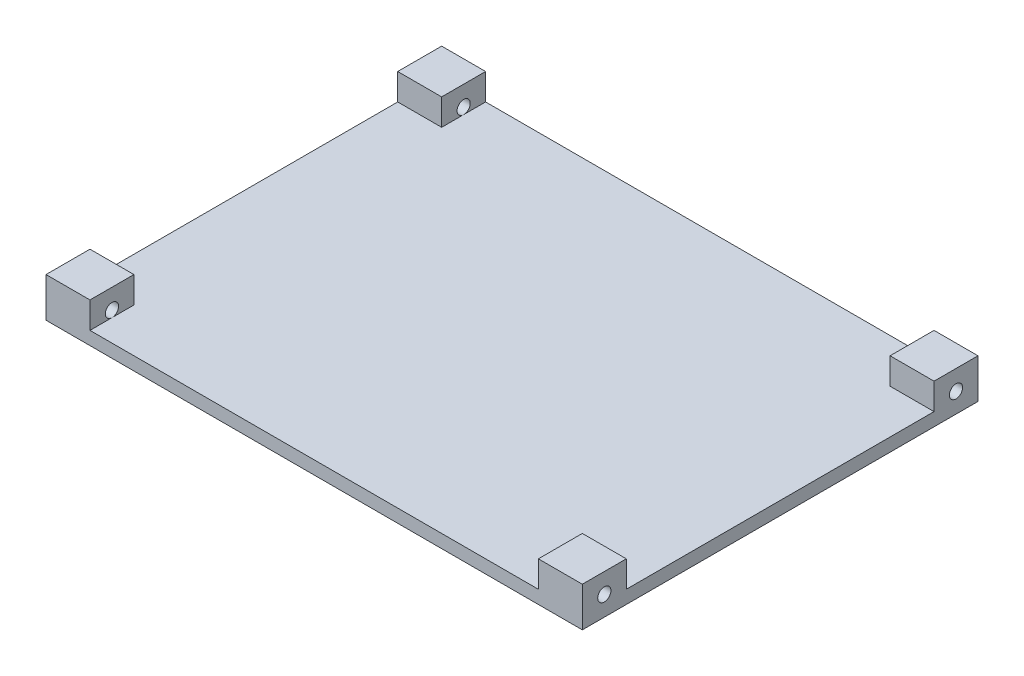
ISO-10303-21;
HEADER;
FILE_DESCRIPTION(('STEP AP214'),'2;1');
FILE_NAME('part.step','',(''),(''),'','','');
FILE_SCHEMA(('AUTOMOTIVE_DESIGN { 1 0 10303 214 1 1 1 1 }'));
ENDSEC;
DATA;
#1=APPLICATION_CONTEXT('core data for automotive mechanical design processes');
#2=APPLICATION_PROTOCOL_DEFINITION('international standard','automotive_design',2000,#1);
#3=PRODUCT_CONTEXT('',#1,'mechanical');
#4=PRODUCT('Part','Part','',(#3));
#5=PRODUCT_RELATED_PRODUCT_CATEGORY('part','',(#4));
#6=PRODUCT_DEFINITION_FORMATION('','',#4);
#7=PRODUCT_DEFINITION_CONTEXT('part definition',#1,'design');
#8=PRODUCT_DEFINITION('design','',#6,#7);
#9=PRODUCT_DEFINITION_SHAPE('','',#8);
#10=(LENGTH_UNIT() NAMED_UNIT(*) SI_UNIT(.MILLI.,.METRE.));
#11=(NAMED_UNIT(*) PLANE_ANGLE_UNIT() SI_UNIT($,.RADIAN.));
#12=(NAMED_UNIT(*) SI_UNIT($,.STERADIAN.) SOLID_ANGLE_UNIT());
#13=UNCERTAINTY_MEASURE_WITH_UNIT(LENGTH_MEASURE(1.E-05),#10,'distance_accuracy_value','');
#14=(GEOMETRIC_REPRESENTATION_CONTEXT(3) GLOBAL_UNCERTAINTY_ASSIGNED_CONTEXT((#13)) GLOBAL_UNIT_ASSIGNED_CONTEXT((#10,
#11,#12)) REPRESENTATION_CONTEXT('',''));
#15=CARTESIAN_POINT('',(0.,0.,0.));
#16=DIRECTION('',(0.,0.,1.));
#17=DIRECTION('',(1.,0.,0.));
#18=AXIS2_PLACEMENT_3D('',#15,#16,#17);
#19=CARTESIAN_POINT('',(0.,3.,0.));
#20=DIRECTION('',(0.,-1.,0.));
#21=DIRECTION('',(0.,0.,-1.));
#22=AXIS2_PLACEMENT_3D('',#19,#20,#21);
#23=PLANE('',#22);
#24=DIRECTION('',(-1.,0.,0.));
#25=VECTOR('',#24,1.);
#26=CARTESIAN_POINT('',(122.,3.,-10.));
#27=LINE('',#26,#25);
#28=CARTESIAN_POINT('',(122.,3.,-10.));
#29=VERTEX_POINT('',#28);
#30=CARTESIAN_POINT('',(112.,3.,-10.));
#31=VERTEX_POINT('',#30);
#32=EDGE_CURVE('E325',#29,#31,#27,.T.);
#33=ORIENTED_EDGE('',*,*,#32,.F.);
#34=DIRECTION('',(0.,0.,-1.));
#35=VECTOR('',#34,1.);
#36=CARTESIAN_POINT('',(122.,3.,0.));
#37=LINE('',#36,#35);
#38=CARTESIAN_POINT('',(122.,3.,-80.));
#39=VERTEX_POINT('',#38);
#40=EDGE_CURVE('E180',#29,#39,#37,.T.);
#41=ORIENTED_EDGE('',*,*,#40,.T.);
#42=DIRECTION('',(1.,0.,0.));
#43=VECTOR('',#42,1.);
#44=CARTESIAN_POINT('',(122.,3.,-80.));
#45=LINE('',#44,#43);
#46=CARTESIAN_POINT('',(112.,3.,-80.));
#47=VERTEX_POINT('',#46);
#48=EDGE_CURVE('E194',#47,#39,#45,.T.);
#49=ORIENTED_EDGE('',*,*,#48,.F.);
#50=DIRECTION('',(0.,0.,1.));
#51=VECTOR('',#50,1.);
#52=CARTESIAN_POINT('',(112.,3.,-90.));
#53=LINE('',#52,#51);
#54=CARTESIAN_POINT('',(112.,3.,-85.));
#55=VERTEX_POINT('',#54);
#56=EDGE_CURVE('E182',#55,#47,#53,.T.);
#57=ORIENTED_EDGE('',*,*,#56,.F.);
#58=CARTESIAN_POINT('',(112.,3.,-90.));
#59=VERTEX_POINT('',#58);
#60=EDGE_CURVE('E184',#59,#55,#53,.T.);
#61=ORIENTED_EDGE('',*,*,#60,.F.);
#62=DIRECTION('',(-1.,0.,0.));
#63=VECTOR('',#62,1.);
#64=CARTESIAN_POINT('',(0.,3.,-90.));
#65=LINE('',#64,#63);
#66=CARTESIAN_POINT('',(10.,3.,-90.));
#67=VERTEX_POINT('',#66);
#68=EDGE_CURVE('E270',#59,#67,#65,.T.);
#69=ORIENTED_EDGE('',*,*,#68,.T.);
#70=DIRECTION('',(0.,0.,-1.));
#71=VECTOR('',#70,1.);
#72=CARTESIAN_POINT('',(10.,3.,-90.));
#73=LINE('',#72,#71);
#74=CARTESIAN_POINT('',(9.99999999999999,3.,-85.));
#75=VERTEX_POINT('',#74);
#76=EDGE_CURVE('E226',#75,#67,#73,.T.);
#77=ORIENTED_EDGE('',*,*,#76,.F.);
#78=CARTESIAN_POINT('',(10.,3.,-80.));
#79=VERTEX_POINT('',#78);
#80=EDGE_CURVE('E216',#79,#75,#73,.T.);
#81=ORIENTED_EDGE('',*,*,#80,.F.);
#82=DIRECTION('',(1.,0.,0.));
#83=VECTOR('',#82,1.);
#84=CARTESIAN_POINT('',(0.,3.,-80.));
#85=LINE('',#84,#83);
#86=CARTESIAN_POINT('',(0.,3.,-80.));
#87=VERTEX_POINT('',#86);
#88=EDGE_CURVE('E211',#87,#79,#85,.T.);
#89=ORIENTED_EDGE('',*,*,#88,.F.);
#90=DIRECTION('',(0.,0.,1.));
#91=VECTOR('',#90,1.);
#92=CARTESIAN_POINT('',(0.,3.,0.));
#93=LINE('',#92,#91);
#94=CARTESIAN_POINT('',(0.,3.,-10.));
#95=VERTEX_POINT('',#94);
#96=EDGE_CURVE('E263',#87,#95,#93,.T.);
#97=ORIENTED_EDGE('',*,*,#96,.T.);
#98=DIRECTION('',(-1.,0.,0.));
#99=VECTOR('',#98,1.);
#100=CARTESIAN_POINT('',(0.,3.,-10.));
#101=LINE('',#100,#99);
#102=CARTESIAN_POINT('',(10.,3.,-10.));
#103=VERTEX_POINT('',#102);
#104=EDGE_CURVE('E242',#103,#95,#101,.T.);
#105=ORIENTED_EDGE('',*,*,#104,.F.);
#106=DIRECTION('',(0.,0.,-1.));
#107=VECTOR('',#106,1.);
#108=CARTESIAN_POINT('',(10.,3.,-10.));
#109=LINE('',#108,#107);
#110=CARTESIAN_POINT('',(9.99999999999999,3.,-5.));
#111=VERTEX_POINT('',#110);
#112=EDGE_CURVE('E237',#111,#103,#109,.T.);
#113=ORIENTED_EDGE('',*,*,#112,.F.);
#114=CARTESIAN_POINT('',(10.,3.,0.));
#115=VERTEX_POINT('',#114);
#116=EDGE_CURVE('E249',#115,#111,#109,.T.);
#117=ORIENTED_EDGE('',*,*,#116,.F.);
#118=DIRECTION('',(1.,0.,0.));
#119=VECTOR('',#118,1.);
#120=CARTESIAN_POINT('',(0.,3.,0.));
#121=LINE('',#120,#119);
#122=CARTESIAN_POINT('',(112.,3.,0.));
#123=VERTEX_POINT('',#122);
#124=EDGE_CURVE('E265',#115,#123,#121,.T.);
#125=ORIENTED_EDGE('',*,*,#124,.T.);
#126=DIRECTION('',(0.,0.,1.));
#127=VECTOR('',#126,1.);
#128=CARTESIAN_POINT('',(112.,3.,0.));
#129=LINE('',#128,#127);
#130=CARTESIAN_POINT('',(112.,3.,-5.));
#131=VERTEX_POINT('',#130);
#132=EDGE_CURVE('E328',#131,#123,#129,.T.);
#133=ORIENTED_EDGE('',*,*,#132,.F.);
#134=EDGE_CURVE('E176',#31,#131,#129,.T.);
#135=ORIENTED_EDGE('',*,*,#134,.F.);
#136=EDGE_LOOP('',(#33,#41,#49,#57,#61,#69,#77,#81,#89,#97,#105,#113,#117,#125,#133,#135));
#137=FACE_BOUND('',#136,.T.);
#138=ADVANCED_FACE('F33',(#137),#23,.F.);
#139=CARTESIAN_POINT('',(0.,3.,0.));
#140=DIRECTION('',(1.,0.,0.));
#141=DIRECTION('',(0.,0.,-1.));
#142=AXIS2_PLACEMENT_3D('',#139,#140,#141);
#143=PLANE('',#142);
#144=CARTESIAN_POINT('',(0.,4.5,-85.));
#145=DIRECTION('',(-1.,0.,0.));
#146=DIRECTION('',(0.,0.,1.));
#147=AXIS2_PLACEMENT_3D('',#144,#145,#146);
#148=CIRCLE('',#147,1.5);
#149=CARTESIAN_POINT('',(0.,4.5,-83.5));
#150=VERTEX_POINT('',#149);
#151=EDGE_CURVE('E331',#150,#150,#148,.T.);
#152=ORIENTED_EDGE('',*,*,#151,.F.);
#153=EDGE_LOOP('',(#152));
#154=FACE_BOUND('',#153,.T.);
#155=CARTESIAN_POINT('',(0.,4.5,-5.));
#156=DIRECTION('',(-1.,0.,0.));
#157=DIRECTION('',(0.,0.,1.));
#158=AXIS2_PLACEMENT_3D('',#155,#156,#157);
#159=CIRCLE('',#158,1.5);
#160=CARTESIAN_POINT('',(0.,4.5,-3.5));
#161=VERTEX_POINT('',#160);
#162=EDGE_CURVE('E341',#161,#161,#159,.T.);
#163=ORIENTED_EDGE('',*,*,#162,.F.);
#164=EDGE_LOOP('',(#163));
#165=FACE_BOUND('',#164,.T.);
#166=DIRECTION('',(0.,0.,1.));
#167=VECTOR('',#166,1.);
#168=CARTESIAN_POINT('',(0.,0.,0.));
#169=LINE('',#168,#167);
#170=CARTESIAN_POINT('',(0.,0.,-90.));
#171=VERTEX_POINT('',#170);
#172=CARTESIAN_POINT('',(0.,0.,0.));
#173=VERTEX_POINT('',#172);
#174=EDGE_CURVE('E262',#171,#173,#169,.T.);
#175=ORIENTED_EDGE('',*,*,#174,.T.);
#176=DIRECTION('',(0.,-1.,0.));
#177=VECTOR('',#176,1.);
#178=CARTESIAN_POINT('',(0.,3.,0.));
#179=LINE('',#178,#177);
#180=CARTESIAN_POINT('',(0.,9.,0.));
#181=VERTEX_POINT('',#180);
#182=EDGE_CURVE('E11',#181,#173,#179,.T.);
#183=ORIENTED_EDGE('',*,*,#182,.F.);
#184=DIRECTION('',(0.,0.,1.));
#185=VECTOR('',#184,1.);
#186=CARTESIAN_POINT('',(0.,9.,0.));
#187=LINE('',#186,#185);
#188=CARTESIAN_POINT('',(0.,9.,-10.));
#189=VERTEX_POINT('',#188);
#190=EDGE_CURVE('E238',#189,#181,#187,.T.);
#191=ORIENTED_EDGE('',*,*,#190,.F.);
#192=DIRECTION('',(0.,-1.,0.));
#193=VECTOR('',#192,1.);
#194=CARTESIAN_POINT('',(0.,9.,-10.));
#195=LINE('',#194,#193);
#196=EDGE_CURVE('E248',#189,#95,#195,.T.);
#197=ORIENTED_EDGE('',*,*,#196,.T.);
#198=ORIENTED_EDGE('',*,*,#96,.F.);
#199=DIRECTION('',(0.,-1.,0.));
#200=VECTOR('',#199,1.);
#201=CARTESIAN_POINT('',(0.,9.,-80.));
#202=LINE('',#201,#200);
#203=CARTESIAN_POINT('',(0.,9.,-80.));
#204=VERTEX_POINT('',#203);
#205=EDGE_CURVE('E234',#204,#87,#202,.T.);
#206=ORIENTED_EDGE('',*,*,#205,.F.);
#207=DIRECTION('',(0.,0.,1.));
#208=VECTOR('',#207,1.);
#209=CARTESIAN_POINT('',(0.,9.,-90.));
#210=LINE('',#209,#208);
#211=CARTESIAN_POINT('',(0.,9.,-90.));
#212=VERTEX_POINT('',#211);
#213=EDGE_CURVE('E212',#212,#204,#210,.T.);
#214=ORIENTED_EDGE('',*,*,#213,.F.);
#215=DIRECTION('',(0.,-1.,0.));
#216=VECTOR('',#215,1.);
#217=CARTESIAN_POINT('',(0.,3.,-90.));
#218=LINE('',#217,#216);
#219=EDGE_CURVE('E273',#212,#171,#218,.T.);
#220=ORIENTED_EDGE('',*,*,#219,.T.);
#221=EDGE_LOOP('',(#175,#183,#191,#197,#198,#206,#214,#220));
#222=FACE_BOUND('',#221,.T.);
#223=ADVANCED_FACE('F35',(#154,#165,#222),#143,.F.);
#224=CARTESIAN_POINT('',(0.,3.,0.));
#225=DIRECTION('',(0.,0.,-1.));
#226=DIRECTION('',(-1.,0.,0.));
#227=AXIS2_PLACEMENT_3D('',#224,#225,#226);
#228=PLANE('',#227);
#229=DIRECTION('',(1.,0.,0.));
#230=VECTOR('',#229,1.);
#231=CARTESIAN_POINT('',(0.,0.,0.));
#232=LINE('',#231,#230);
#233=CARTESIAN_POINT('',(122.,0.,0.));
#234=VERTEX_POINT('',#233);
#235=EDGE_CURVE('E276',#173,#234,#232,.T.);
#236=ORIENTED_EDGE('',*,*,#235,.T.);
#237=DIRECTION('',(0.,-1.,0.));
#238=VECTOR('',#237,1.);
#239=CARTESIAN_POINT('',(122.,3.,0.));
#240=LINE('',#239,#238);
#241=CARTESIAN_POINT('',(122.,9.,0.));
#242=VERTEX_POINT('',#241);
#243=EDGE_CURVE('E41',#242,#234,#240,.T.);
#244=ORIENTED_EDGE('',*,*,#243,.F.);
#245=DIRECTION('',(1.,0.,0.));
#246=VECTOR('',#245,1.);
#247=CARTESIAN_POINT('',(122.,9.,0.));
#248=LINE('',#247,#246);
#249=CARTESIAN_POINT('',(112.,9.,0.));
#250=VERTEX_POINT('',#249);
#251=EDGE_CURVE('E173',#250,#242,#248,.T.);
#252=ORIENTED_EDGE('',*,*,#251,.F.);
#253=DIRECTION('',(0.,-1.,0.));
#254=VECTOR('',#253,1.);
#255=CARTESIAN_POINT('',(112.,9.,0.));
#256=LINE('',#255,#254);
#257=EDGE_CURVE('E186',#250,#123,#256,.T.);
#258=ORIENTED_EDGE('',*,*,#257,.T.);
#259=ORIENTED_EDGE('',*,*,#124,.F.);
#260=DIRECTION('',(0.,-1.,0.));
#261=VECTOR('',#260,1.);
#262=CARTESIAN_POINT('',(10.,9.,0.));
#263=LINE('',#262,#261);
#264=CARTESIAN_POINT('',(10.,9.,0.));
#265=VERTEX_POINT('',#264);
#266=EDGE_CURVE('E259',#265,#115,#263,.T.);
#267=ORIENTED_EDGE('',*,*,#266,.F.);
#268=DIRECTION('',(1.,0.,0.));
#269=VECTOR('',#268,1.);
#270=CARTESIAN_POINT('',(0.,9.,0.));
#271=LINE('',#270,#269);
#272=EDGE_CURVE('E241',#181,#265,#271,.T.);
#273=ORIENTED_EDGE('',*,*,#272,.F.);
#274=ORIENTED_EDGE('',*,*,#182,.T.);
#275=EDGE_LOOP('',(#236,#244,#252,#258,#259,#267,#273,#274));
#276=FACE_BOUND('',#275,.T.);
#277=ADVANCED_FACE('F359',(#276),#228,.F.);
#278=CARTESIAN_POINT('',(122.,3.,0.));
#279=DIRECTION('',(-1.,0.,0.));
#280=DIRECTION('',(0.,0.,1.));
#281=AXIS2_PLACEMENT_3D('',#278,#279,#280);
#282=PLANE('',#281);
#283=CARTESIAN_POINT('',(122.,4.5,-85.));
#284=DIRECTION('',(1.,0.,0.));
#285=DIRECTION('',(0.,0.,-1.));
#286=AXIS2_PLACEMENT_3D('',#283,#284,#285);
#287=CIRCLE('',#286,1.5);
#288=CARTESIAN_POINT('',(122.,4.5,-86.5));
#289=VERTEX_POINT('',#288);
#290=EDGE_CURVE('E347',#289,#289,#287,.T.);
#291=ORIENTED_EDGE('',*,*,#290,.F.);
#292=EDGE_LOOP('',(#291));
#293=FACE_BOUND('',#292,.T.);
#294=CARTESIAN_POINT('',(122.,4.5,-5.));
#295=DIRECTION('',(1.,0.,0.));
#296=DIRECTION('',(0.,0.,-1.));
#297=AXIS2_PLACEMENT_3D('',#294,#295,#296);
#298=CIRCLE('',#297,1.5);
#299=CARTESIAN_POINT('',(122.,4.5,-6.5));
#300=VERTEX_POINT('',#299);
#301=EDGE_CURVE('E348',#300,#300,#298,.T.);
#302=ORIENTED_EDGE('',*,*,#301,.F.);
#303=EDGE_LOOP('',(#302));
#304=FACE_BOUND('',#303,.T.);
#305=DIRECTION('',(0.,0.,-1.));
#306=VECTOR('',#305,1.);
#307=CARTESIAN_POINT('',(122.,0.,0.));
#308=LINE('',#307,#306);
#309=CARTESIAN_POINT('',(122.,0.,-90.));
#310=VERTEX_POINT('',#309);
#311=EDGE_CURVE('E278',#234,#310,#308,.T.);
#312=ORIENTED_EDGE('',*,*,#311,.T.);
#313=DIRECTION('',(0.,-1.,0.));
#314=VECTOR('',#313,1.);
#315=CARTESIAN_POINT('',(122.,3.,-90.));
#316=LINE('',#315,#314);
#317=CARTESIAN_POINT('',(122.,9.,-90.));
#318=VERTEX_POINT('',#317);
#319=EDGE_CURVE('E283',#318,#310,#316,.T.);
#320=ORIENTED_EDGE('',*,*,#319,.F.);
#321=DIRECTION('',(0.,0.,-1.));
#322=VECTOR('',#321,1.);
#323=CARTESIAN_POINT('',(122.,9.,-90.));
#324=LINE('',#323,#322);
#325=CARTESIAN_POINT('',(122.,9.,-80.));
#326=VERTEX_POINT('',#325);
#327=EDGE_CURVE('E190',#326,#318,#324,.T.);
#328=ORIENTED_EDGE('',*,*,#327,.F.);
#329=DIRECTION('',(0.,-1.,0.));
#330=VECTOR('',#329,1.);
#331=CARTESIAN_POINT('',(122.,9.,-80.));
#332=LINE('',#331,#330);
#333=EDGE_CURVE('E199',#326,#39,#332,.T.);
#334=ORIENTED_EDGE('',*,*,#333,.T.);
#335=ORIENTED_EDGE('',*,*,#40,.F.);
#336=DIRECTION('',(0.,-1.,0.));
#337=VECTOR('',#336,1.);
#338=CARTESIAN_POINT('',(122.,9.,-10.));
#339=LINE('',#338,#337);
#340=CARTESIAN_POINT('',(122.,9.,-10.));
#341=VERTEX_POINT('',#340);
#342=EDGE_CURVE('E161',#341,#29,#339,.T.);
#343=ORIENTED_EDGE('',*,*,#342,.F.);
#344=DIRECTION('',(0.,0.,-1.));
#345=VECTOR('',#344,1.);
#346=CARTESIAN_POINT('',(122.,9.,0.));
#347=LINE('',#346,#345);
#348=EDGE_CURVE('E167',#242,#341,#347,.T.);
#349=ORIENTED_EDGE('',*,*,#348,.F.);
#350=ORIENTED_EDGE('',*,*,#243,.T.);
#351=EDGE_LOOP('',(#312,#320,#328,#334,#335,#343,#349,#350));
#352=FACE_BOUND('',#351,.T.);
#353=ADVANCED_FACE('F178',(#293,#304,#352),#282,.F.);
#354=CARTESIAN_POINT('',(0.,3.,-90.));
#355=DIRECTION('',(0.,0.,1.));
#356=DIRECTION('',(1.,0.,0.));
#357=AXIS2_PLACEMENT_3D('',#354,#355,#356);
#358=PLANE('',#357);
#359=DIRECTION('',(-1.,0.,0.));
#360=VECTOR('',#359,1.);
#361=CARTESIAN_POINT('',(0.,0.,-90.));
#362=LINE('',#361,#360);
#363=EDGE_CURVE('E266',#310,#171,#362,.T.);
#364=ORIENTED_EDGE('',*,*,#363,.T.);
#365=ORIENTED_EDGE('',*,*,#219,.F.);
#366=DIRECTION('',(-1.,0.,0.));
#367=VECTOR('',#366,1.);
#368=CARTESIAN_POINT('',(0.,9.,-90.));
#369=LINE('',#368,#367);
#370=CARTESIAN_POINT('',(10.,9.,-90.));
#371=VERTEX_POINT('',#370);
#372=EDGE_CURVE('E220',#371,#212,#369,.T.);
#373=ORIENTED_EDGE('',*,*,#372,.F.);
#374=DIRECTION('',(0.,-1.,0.));
#375=VECTOR('',#374,1.);
#376=CARTESIAN_POINT('',(10.,9.,-90.));
#377=LINE('',#376,#375);
#378=EDGE_CURVE('E223',#371,#67,#377,.T.);
#379=ORIENTED_EDGE('',*,*,#378,.T.);
#380=ORIENTED_EDGE('',*,*,#68,.F.);
#381=DIRECTION('',(0.,-1.,0.));
#382=VECTOR('',#381,1.);
#383=CARTESIAN_POINT('',(112.,9.,-90.));
#384=LINE('',#383,#382);
#385=CARTESIAN_POINT('',(112.,9.,-90.));
#386=VERTEX_POINT('',#385);
#387=EDGE_CURVE('E208',#386,#59,#384,.T.);
#388=ORIENTED_EDGE('',*,*,#387,.F.);
#389=DIRECTION('',(-1.,0.,0.));
#390=VECTOR('',#389,1.);
#391=CARTESIAN_POINT('',(122.,9.,-90.));
#392=LINE('',#391,#390);
#393=EDGE_CURVE('E193',#318,#386,#392,.T.);
#394=ORIENTED_EDGE('',*,*,#393,.F.);
#395=ORIENTED_EDGE('',*,*,#319,.T.);
#396=EDGE_LOOP('',(#364,#365,#373,#379,#380,#388,#394,#395));
#397=FACE_BOUND('',#396,.T.);
#398=ADVANCED_FACE('F292',(#397),#358,.F.);
#399=CARTESIAN_POINT('',(0.,0.,0.));
#400=DIRECTION('',(0.,-1.,0.));
#401=DIRECTION('',(0.,0.,-1.));
#402=AXIS2_PLACEMENT_3D('',#399,#400,#401);
#403=PLANE('',#402);
#404=ORIENTED_EDGE('',*,*,#174,.F.);
#405=ORIENTED_EDGE('',*,*,#363,.F.);
#406=ORIENTED_EDGE('',*,*,#311,.F.);
#407=ORIENTED_EDGE('',*,*,#235,.F.);
#408=EDGE_LOOP('',(#404,#405,#406,#407));
#409=FACE_BOUND('',#408,.T.);
#410=ADVANCED_FACE('F290',(#409),#403,.T.);
#411=CARTESIAN_POINT('',(10.,9.,-10.));
#412=DIRECTION('',(-1.,0.,0.));
#413=DIRECTION('',(0.,0.,1.));
#414=AXIS2_PLACEMENT_3D('',#411,#412,#413);
#415=PLANE('',#414);
#416=ORIENTED_EDGE('',*,*,#116,.T.);
#417=CARTESIAN_POINT('',(9.99999999999999,4.5,-5.));
#418=DIRECTION('',(-1.,0.,0.));
#419=DIRECTION('',(0.,0.,1.));
#420=AXIS2_PLACEMENT_3D('',#417,#418,#419);
#421=CIRCLE('',#420,1.5);
#422=EDGE_CURVE('E339',#111,#111,#421,.F.);
#423=ORIENTED_EDGE('',*,*,#422,.F.);
#424=ORIENTED_EDGE('',*,*,#112,.T.);
#425=DIRECTION('',(0.,-1.,0.));
#426=VECTOR('',#425,1.);
#427=CARTESIAN_POINT('',(10.,9.,-10.));
#428=LINE('',#427,#426);
#429=CARTESIAN_POINT('',(10.,9.,-10.));
#430=VERTEX_POINT('',#429);
#431=EDGE_CURVE('E256',#430,#103,#428,.T.);
#432=ORIENTED_EDGE('',*,*,#431,.F.);
#433=DIRECTION('',(0.,0.,-1.));
#434=VECTOR('',#433,1.);
#435=CARTESIAN_POINT('',(10.,9.,0.));
#436=LINE('',#435,#434);
#437=EDGE_CURVE('E244',#265,#430,#436,.T.);
#438=ORIENTED_EDGE('',*,*,#437,.F.);
#439=ORIENTED_EDGE('',*,*,#266,.T.);
#440=EDGE_LOOP('',(#416,#423,#424,#432,#438,#439));
#441=FACE_BOUND('',#440,.T.);
#442=ADVANCED_FACE('F384',(#441),#415,.F.);
#443=CARTESIAN_POINT('',(0.,9.,-10.));
#444=DIRECTION('',(0.,0.,1.));
#445=DIRECTION('',(1.,0.,0.));
#446=AXIS2_PLACEMENT_3D('',#443,#444,#445);
#447=PLANE('',#446);
#448=ORIENTED_EDGE('',*,*,#104,.T.);
#449=ORIENTED_EDGE('',*,*,#196,.F.);
#450=DIRECTION('',(-1.,0.,0.));
#451=VECTOR('',#450,1.);
#452=CARTESIAN_POINT('',(7.78112740353881,9.,-10.));
#453=LINE('',#452,#451);
#454=EDGE_CURVE('E246',#430,#189,#453,.T.);
#455=ORIENTED_EDGE('',*,*,#454,.F.);
#456=ORIENTED_EDGE('',*,*,#431,.T.);
#457=EDGE_LOOP('',(#448,#449,#455,#456));
#458=FACE_BOUND('',#457,.T.);
#459=ADVANCED_FACE('F402',(#458),#447,.F.);
#460=CARTESIAN_POINT('',(0.,9.,0.));
#461=DIRECTION('',(0.,-1.,0.));
#462=DIRECTION('',(0.,0.,-1.));
#463=AXIS2_PLACEMENT_3D('',#460,#461,#462);
#464=PLANE('',#463);
#465=ORIENTED_EDGE('',*,*,#190,.T.);
#466=ORIENTED_EDGE('',*,*,#272,.T.);
#467=ORIENTED_EDGE('',*,*,#437,.T.);
#468=ORIENTED_EDGE('',*,*,#454,.T.);
#469=EDGE_LOOP('',(#465,#466,#467,#468));
#470=FACE_BOUND('',#469,.T.);
#471=ADVANCED_FACE('F397',(#470),#464,.F.);
#472=CARTESIAN_POINT('',(0.,9.,-80.));
#473=DIRECTION('',(0.,0.,-1.));
#474=DIRECTION('',(-1.,0.,0.));
#475=AXIS2_PLACEMENT_3D('',#472,#473,#474);
#476=PLANE('',#475);
#477=ORIENTED_EDGE('',*,*,#88,.T.);
#478=DIRECTION('',(0.,-1.,0.));
#479=VECTOR('',#478,1.);
#480=CARTESIAN_POINT('',(10.,9.,-80.));
#481=LINE('',#480,#479);
#482=CARTESIAN_POINT('',(10.,9.,-80.));
#483=VERTEX_POINT('',#482);
#484=EDGE_CURVE('E231',#483,#79,#481,.T.);
#485=ORIENTED_EDGE('',*,*,#484,.F.);
#486=DIRECTION('',(1.,0.,0.));
#487=VECTOR('',#486,1.);
#488=CARTESIAN_POINT('',(0.,9.,-80.));
#489=LINE('',#488,#487);
#490=EDGE_CURVE('E215',#204,#483,#489,.T.);
#491=ORIENTED_EDGE('',*,*,#490,.F.);
#492=ORIENTED_EDGE('',*,*,#205,.T.);
#493=EDGE_LOOP('',(#477,#485,#491,#492));
#494=FACE_BOUND('',#493,.T.);
#495=ADVANCED_FACE('F406',(#494),#476,.F.);
#496=CARTESIAN_POINT('',(10.,9.,-90.));
#497=DIRECTION('',(-1.,0.,0.));
#498=DIRECTION('',(0.,0.,1.));
#499=AXIS2_PLACEMENT_3D('',#496,#497,#498);
#500=PLANE('',#499);
#501=ORIENTED_EDGE('',*,*,#80,.T.);
#502=CARTESIAN_POINT('',(9.99999999999999,4.5,-85.));
#503=DIRECTION('',(-1.,0.,0.));
#504=DIRECTION('',(0.,0.,1.));
#505=AXIS2_PLACEMENT_3D('',#502,#503,#504);
#506=CIRCLE('',#505,1.5);
#507=EDGE_CURVE('E310',#75,#75,#506,.F.);
#508=ORIENTED_EDGE('',*,*,#507,.F.);
#509=ORIENTED_EDGE('',*,*,#76,.T.);
#510=ORIENTED_EDGE('',*,*,#378,.F.);
#511=DIRECTION('',(0.,0.,-1.));
#512=VECTOR('',#511,1.);
#513=CARTESIAN_POINT('',(10.,9.,-90.));
#514=LINE('',#513,#512);
#515=EDGE_CURVE('E218',#483,#371,#514,.T.);
#516=ORIENTED_EDGE('',*,*,#515,.F.);
#517=ORIENTED_EDGE('',*,*,#484,.T.);
#518=EDGE_LOOP('',(#501,#508,#509,#510,#516,#517));
#519=FACE_BOUND('',#518,.T.);
#520=ADVANCED_FACE('F307',(#519),#500,.F.);
#521=CARTESIAN_POINT('',(0.,9.,0.));
#522=DIRECTION('',(0.,1.,0.));
#523=DIRECTION('',(0.,0.,1.));
#524=AXIS2_PLACEMENT_3D('',#521,#522,#523);
#525=PLANE('',#524);
#526=ORIENTED_EDGE('',*,*,#213,.T.);
#527=ORIENTED_EDGE('',*,*,#490,.T.);
#528=ORIENTED_EDGE('',*,*,#515,.T.);
#529=ORIENTED_EDGE('',*,*,#372,.T.);
#530=EDGE_LOOP('',(#526,#527,#528,#529));
#531=FACE_BOUND('',#530,.T.);
#532=ADVANCED_FACE('F300',(#531),#525,.T.);
#533=CARTESIAN_POINT('',(112.,9.,-90.));
#534=DIRECTION('',(1.,0.,0.));
#535=DIRECTION('',(0.,0.,-1.));
#536=AXIS2_PLACEMENT_3D('',#533,#534,#535);
#537=PLANE('',#536);
#538=ORIENTED_EDGE('',*,*,#60,.T.);
#539=CARTESIAN_POINT('',(112.,4.5,-85.));
#540=DIRECTION('',(1.,0.,0.));
#541=DIRECTION('',(0.,0.,-1.));
#542=AXIS2_PLACEMENT_3D('',#539,#540,#541);
#543=CIRCLE('',#542,1.5);
#544=EDGE_CURVE('E46',#55,#55,#543,.F.);
#545=ORIENTED_EDGE('',*,*,#544,.F.);
#546=ORIENTED_EDGE('',*,*,#56,.T.);
#547=DIRECTION('',(0.,-1.,0.));
#548=VECTOR('',#547,1.);
#549=CARTESIAN_POINT('',(112.,9.,-80.));
#550=LINE('',#549,#548);
#551=CARTESIAN_POINT('',(112.,9.,-80.));
#552=VERTEX_POINT('',#551);
#553=EDGE_CURVE('E205',#552,#47,#550,.T.);
#554=ORIENTED_EDGE('',*,*,#553,.F.);
#555=DIRECTION('',(0.,0.,1.));
#556=VECTOR('',#555,1.);
#557=CARTESIAN_POINT('',(112.,9.,-90.));
#558=LINE('',#557,#556);
#559=EDGE_CURVE('E196',#386,#552,#558,.T.);
#560=ORIENTED_EDGE('',*,*,#559,.F.);
#561=ORIENTED_EDGE('',*,*,#387,.T.);
#562=EDGE_LOOP('',(#538,#545,#546,#554,#560,#561));
#563=FACE_BOUND('',#562,.T.);
#564=ADVANCED_FACE('F316',(#563),#537,.F.);
#565=CARTESIAN_POINT('',(122.,9.,-80.));
#566=DIRECTION('',(0.,0.,-1.));
#567=DIRECTION('',(-1.,0.,0.));
#568=AXIS2_PLACEMENT_3D('',#565,#566,#567);
#569=PLANE('',#568);
#570=ORIENTED_EDGE('',*,*,#48,.T.);
#571=ORIENTED_EDGE('',*,*,#333,.F.);
#572=DIRECTION('',(1.,0.,0.));
#573=VECTOR('',#572,1.);
#574=CARTESIAN_POINT('',(122.,9.,-80.));
#575=LINE('',#574,#573);
#576=EDGE_CURVE('E198',#552,#326,#575,.T.);
#577=ORIENTED_EDGE('',*,*,#576,.F.);
#578=ORIENTED_EDGE('',*,*,#553,.T.);
#579=EDGE_LOOP('',(#570,#571,#577,#578));
#580=FACE_BOUND('',#579,.T.);
#581=ADVANCED_FACE('F324',(#580),#569,.F.);
#582=CARTESIAN_POINT('',(0.,9.,0.));
#583=DIRECTION('',(0.,-1.,0.));
#584=DIRECTION('',(0.,0.,-1.));
#585=AXIS2_PLACEMENT_3D('',#582,#583,#584);
#586=PLANE('',#585);
#587=ORIENTED_EDGE('',*,*,#327,.T.);
#588=ORIENTED_EDGE('',*,*,#393,.T.);
#589=ORIENTED_EDGE('',*,*,#559,.T.);
#590=ORIENTED_EDGE('',*,*,#576,.T.);
#591=EDGE_LOOP('',(#587,#588,#589,#590));
#592=FACE_BOUND('',#591,.T.);
#593=ADVANCED_FACE('F320',(#592),#586,.F.);
#594=CARTESIAN_POINT('',(122.,9.,-10.));
#595=DIRECTION('',(0.,0.,1.));
#596=DIRECTION('',(1.,0.,0.));
#597=AXIS2_PLACEMENT_3D('',#594,#595,#596);
#598=PLANE('',#597);
#599=ORIENTED_EDGE('',*,*,#32,.T.);
#600=DIRECTION('',(0.,-1.,0.));
#601=VECTOR('',#600,1.);
#602=CARTESIAN_POINT('',(112.,9.,-10.));
#603=LINE('',#602,#601);
#604=CARTESIAN_POINT('',(112.,9.,-10.));
#605=VERTEX_POINT('',#604);
#606=EDGE_CURVE('E163',#605,#31,#603,.T.);
#607=ORIENTED_EDGE('',*,*,#606,.F.);
#608=DIRECTION('',(-1.,0.,0.));
#609=VECTOR('',#608,1.);
#610=CARTESIAN_POINT('',(122.,9.,-10.));
#611=LINE('',#610,#609);
#612=EDGE_CURVE('E156',#341,#605,#611,.T.);
#613=ORIENTED_EDGE('',*,*,#612,.F.);
#614=ORIENTED_EDGE('',*,*,#342,.T.);
#615=EDGE_LOOP('',(#599,#607,#613,#614));
#616=FACE_BOUND('',#615,.T.);
#617=ADVANCED_FACE('F159',(#616),#598,.F.);
#618=CARTESIAN_POINT('',(112.,9.,0.));
#619=DIRECTION('',(1.,0.,0.));
#620=DIRECTION('',(0.,0.,-1.));
#621=AXIS2_PLACEMENT_3D('',#618,#619,#620);
#622=PLANE('',#621);
#623=ORIENTED_EDGE('',*,*,#134,.T.);
#624=CARTESIAN_POINT('',(112.,4.5,-5.));
#625=DIRECTION('',(1.,0.,0.));
#626=DIRECTION('',(0.,0.,-1.));
#627=AXIS2_PLACEMENT_3D('',#624,#625,#626);
#628=CIRCLE('',#627,1.5);
#629=EDGE_CURVE('E51',#131,#131,#628,.F.);
#630=ORIENTED_EDGE('',*,*,#629,.F.);
#631=ORIENTED_EDGE('',*,*,#132,.T.);
#632=ORIENTED_EDGE('',*,*,#257,.F.);
#633=DIRECTION('',(0.,0.,1.));
#634=VECTOR('',#633,1.);
#635=CARTESIAN_POINT('',(112.,9.,0.));
#636=LINE('',#635,#634);
#637=EDGE_CURVE('E166',#605,#250,#636,.T.);
#638=ORIENTED_EDGE('',*,*,#637,.F.);
#639=ORIENTED_EDGE('',*,*,#606,.T.);
#640=EDGE_LOOP('',(#623,#630,#631,#632,#638,#639));
#641=FACE_BOUND('',#640,.T.);
#642=ADVANCED_FACE('F425',(#641),#622,.F.);
#643=CARTESIAN_POINT('',(0.,9.,0.));
#644=DIRECTION('',(0.,1.,0.));
#645=DIRECTION('',(0.,0.,1.));
#646=AXIS2_PLACEMENT_3D('',#643,#644,#645);
#647=PLANE('',#646);
#648=ORIENTED_EDGE('',*,*,#348,.T.);
#649=ORIENTED_EDGE('',*,*,#612,.T.);
#650=ORIENTED_EDGE('',*,*,#637,.T.);
#651=ORIENTED_EDGE('',*,*,#251,.T.);
#652=EDGE_LOOP('',(#648,#649,#650,#651));
#653=FACE_BOUND('',#652,.T.);
#654=ADVANCED_FACE('F171',(#653),#647,.T.);
#655=CARTESIAN_POINT('',(122.001,4.5,-85.));
#656=DIRECTION('',(-1.,0.,0.));
#657=DIRECTION('',(0.,0.,1.));
#658=AXIS2_PLACEMENT_3D('',#655,#656,#657);
#659=CYLINDRICAL_SURFACE('',#658,1.5);
#660=ORIENTED_EDGE('',*,*,#151,.T.);
#661=EDGE_LOOP('',(#660));
#662=FACE_BOUND('',#661,.T.);
#663=ORIENTED_EDGE('',*,*,#507,.T.);
#664=EDGE_LOOP('',(#663));
#665=FACE_BOUND('',#664,.T.);
#666=ADVANCED_FACE('F372',(#662,#665),#659,.F.);
#667=CARTESIAN_POINT('',(122.001,4.5,-5.));
#668=DIRECTION('',(-1.,0.,0.));
#669=DIRECTION('',(0.,0.,1.));
#670=AXIS2_PLACEMENT_3D('',#667,#668,#669);
#671=CYLINDRICAL_SURFACE('',#670,1.5);
#672=ORIENTED_EDGE('',*,*,#162,.T.);
#673=EDGE_LOOP('',(#672));
#674=FACE_BOUND('',#673,.T.);
#675=ORIENTED_EDGE('',*,*,#422,.T.);
#676=EDGE_LOOP('',(#675));
#677=FACE_BOUND('',#676,.T.);
#678=ADVANCED_FACE('F365',(#674,#677),#671,.F.);
#679=CARTESIAN_POINT('',(-0.001000000000001,4.5,-5.));
#680=DIRECTION('',(1.,0.,0.));
#681=DIRECTION('',(0.,0.,-1.));
#682=AXIS2_PLACEMENT_3D('',#679,#680,#681);
#683=CYLINDRICAL_SURFACE('',#682,1.5);
#684=ORIENTED_EDGE('',*,*,#301,.T.);
#685=EDGE_LOOP('',(#684));
#686=FACE_BOUND('',#685,.T.);
#687=ORIENTED_EDGE('',*,*,#629,.T.);
#688=EDGE_LOOP('',(#687));
#689=FACE_BOUND('',#688,.T.);
#690=ADVANCED_FACE('F363',(#686,#689),#683,.F.);
#691=CARTESIAN_POINT('',(-0.001000000000001,4.5,-85.));
#692=DIRECTION('',(1.,0.,0.));
#693=DIRECTION('',(0.,0.,-1.));
#694=AXIS2_PLACEMENT_3D('',#691,#692,#693);
#695=CYLINDRICAL_SURFACE('',#694,1.5);
#696=ORIENTED_EDGE('',*,*,#290,.T.);
#697=EDGE_LOOP('',(#696));
#698=FACE_BOUND('',#697,.T.);
#699=ORIENTED_EDGE('',*,*,#544,.T.);
#700=EDGE_LOOP('',(#699));
#701=FACE_BOUND('',#700,.T.);
#702=ADVANCED_FACE('F355',(#698,#701),#695,.F.);
#703=CLOSED_SHELL('',(#138,#223,#277,#353,#398,#410,#442,#459,#471,#495,#520,#532,#564,#581,
#593,#617,#642,#654,#666,#678,#690,#702));
#704=MANIFOLD_SOLID_BREP('B2',#703);
#705=ADVANCED_BREP_SHAPE_REPRESENTATION('',(#18,#704),#14);
#706=SHAPE_DEFINITION_REPRESENTATION(#9,#705);
ENDSEC;
END-ISO-10303-21;
